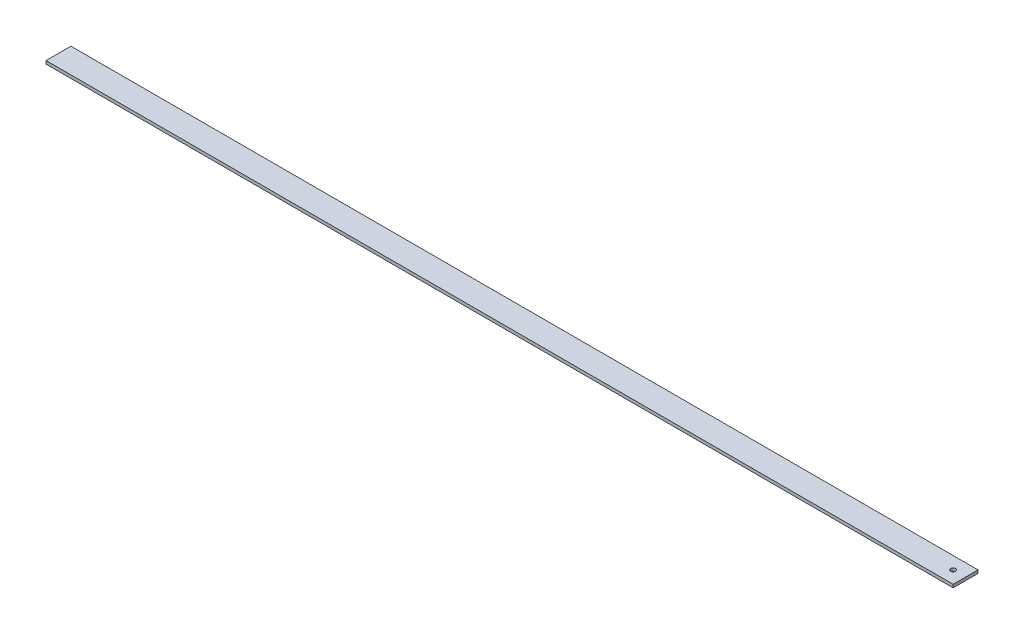
ISO-10303-21;
HEADER;
FILE_DESCRIPTION(('STEP AP214'),'2;1');
FILE_NAME('part.step','',(''),(''),'','','');
FILE_SCHEMA(('AUTOMOTIVE_DESIGN { 1 0 10303 214 1 1 1 1 }'));
ENDSEC;
DATA;
#1=APPLICATION_CONTEXT('core data for automotive mechanical design processes');
#2=APPLICATION_PROTOCOL_DEFINITION('international standard','automotive_design',2000,#1);
#3=PRODUCT_CONTEXT('',#1,'mechanical');
#4=PRODUCT('Part','Part','',(#3));
#5=PRODUCT_RELATED_PRODUCT_CATEGORY('part','',(#4));
#6=PRODUCT_DEFINITION_FORMATION('','',#4);
#7=PRODUCT_DEFINITION_CONTEXT('part definition',#1,'design');
#8=PRODUCT_DEFINITION('design','',#6,#7);
#9=PRODUCT_DEFINITION_SHAPE('','',#8);
#10=(LENGTH_UNIT() NAMED_UNIT(*) SI_UNIT(.MILLI.,.METRE.));
#11=(NAMED_UNIT(*) PLANE_ANGLE_UNIT() SI_UNIT($,.RADIAN.));
#12=(NAMED_UNIT(*) SI_UNIT($,.STERADIAN.) SOLID_ANGLE_UNIT());
#13=UNCERTAINTY_MEASURE_WITH_UNIT(LENGTH_MEASURE(1.E-05),#10,'distance_accuracy_value','');
#14=(GEOMETRIC_REPRESENTATION_CONTEXT(3) GLOBAL_UNCERTAINTY_ASSIGNED_CONTEXT((#13)) GLOBAL_UNIT_ASSIGNED_CONTEXT((#10,
#11,#12)) REPRESENTATION_CONTEXT('',''));
#15=CARTESIAN_POINT('',(0.,0.,0.));
#16=DIRECTION('',(0.,0.,1.));
#17=DIRECTION('',(1.,0.,0.));
#18=AXIS2_PLACEMENT_3D('',#15,#16,#17);
#19=CARTESIAN_POINT('',(-50.799999999998,6.31,249.702795));
#20=DIRECTION('',(1.,0.,0.));
#21=DIRECTION('',(0.,0.,-1.));
#22=AXIS2_PLACEMENT_3D('',#19,#20,#21);
#23=PLANE('',#22);
#24=DIRECTION('',(0.,-1.,0.));
#25=VECTOR('',#24,1.);
#26=CARTESIAN_POINT('',(-50.799999999998,114.31,198.902795));
#27=LINE('',#26,#25);
#28=CARTESIAN_POINT('',(-50.799999999998,6.31,198.902795));
#29=VERTEX_POINT('',#28);
#30=CARTESIAN_POINT('',(-50.799999999998,0.,198.902795));
#31=VERTEX_POINT('',#30);
#32=EDGE_CURVE('E78',#29,#31,#27,.T.);
#33=ORIENTED_EDGE('',*,*,#32,.T.);
#34=DIRECTION('',(0.,0.,1.));
#35=VECTOR('',#34,1.);
#36=CARTESIAN_POINT('',(-50.799999999998,0.,249.702795));
#37=LINE('',#36,#35);
#38=CARTESIAN_POINT('',(-50.799999999998,0.,249.702795));
#39=VERTEX_POINT('',#38);
#40=EDGE_CURVE('E89',#31,#39,#37,.T.);
#41=ORIENTED_EDGE('',*,*,#40,.T.);
#42=DIRECTION('',(0.,-1.,0.));
#43=VECTOR('',#42,1.);
#44=CARTESIAN_POINT('',(-50.799999999998,6.31,249.702795));
#45=LINE('',#44,#43);
#46=CARTESIAN_POINT('',(-50.799999999998,6.31,249.702795));
#47=VERTEX_POINT('',#46);
#48=EDGE_CURVE('E11',#47,#39,#45,.T.);
#49=ORIENTED_EDGE('',*,*,#48,.F.);
#50=DIRECTION('',(0.,0.,1.));
#51=VECTOR('',#50,1.);
#52=CARTESIAN_POINT('',(-50.799999999998,6.31,249.702795));
#53=LINE('',#52,#51);
#54=EDGE_CURVE('E47',#29,#47,#53,.T.);
#55=ORIENTED_EDGE('',*,*,#54,.F.);
#56=EDGE_LOOP('',(#33,#41,#49,#55));
#57=FACE_BOUND('',#56,.T.);
#58=ADVANCED_FACE('F32',(#57),#23,.F.);
#59=CARTESIAN_POINT('',(0.,6.31,0.));
#60=DIRECTION('',(0.,-1.,0.));
#61=DIRECTION('',(0.,0.,-1.));
#62=AXIS2_PLACEMENT_3D('',#59,#60,#61);
#63=PLANE('',#62);
#64=CARTESIAN_POINT('',(1774.69999999998,6.31,224.302795000009));
#65=DIRECTION('',(0.,-1.,0.));
#66=DIRECTION('',(0.,0.,-1.));
#67=AXIS2_PLACEMENT_3D('',#64,#65,#66);
#68=CIRCLE('',#67,4.99999999997232);
#69=CARTESIAN_POINT('',(1774.69999999998,6.31,219.302795000037));
#70=VERTEX_POINT('',#69);
#71=EDGE_CURVE('E90',#70,#70,#68,.T.);
#72=ORIENTED_EDGE('',*,*,#71,.T.);
#73=EDGE_LOOP('',(#72));
#74=FACE_BOUND('',#73,.T.);
#75=DIRECTION('',(-1.,0.,0.));
#76=VECTOR('',#75,1.);
#77=CARTESIAN_POINT('',(-1.11022302462516E-13,6.31,198.902795));
#78=LINE('',#77,#76);
#79=CARTESIAN_POINT('',(1800.1,6.31,198.902795));
#80=VERTEX_POINT('',#79);
#81=EDGE_CURVE('E67',#80,#29,#78,.T.);
#82=ORIENTED_EDGE('',*,*,#81,.T.);
#83=ORIENTED_EDGE('',*,*,#54,.T.);
#84=DIRECTION('',(1.,0.,0.));
#85=VECTOR('',#84,1.);
#86=CARTESIAN_POINT('',(1742.85,6.31,249.702795));
#87=LINE('',#86,#85);
#88=CARTESIAN_POINT('',(1800.1,6.31,249.702795));
#89=VERTEX_POINT('',#88);
#90=EDGE_CURVE('E41',#47,#89,#87,.T.);
#91=ORIENTED_EDGE('',*,*,#90,.T.);
#92=DIRECTION('',(0.,0.,1.));
#93=VECTOR('',#92,1.);
#94=CARTESIAN_POINT('',(1800.1,6.31,249.702795));
#95=LINE('',#94,#93);
#96=EDGE_CURVE('E71',#80,#89,#95,.T.);
#97=ORIENTED_EDGE('',*,*,#96,.F.);
#98=EDGE_LOOP('',(#82,#83,#91,#97));
#99=FACE_BOUND('',#98,.T.);
#100=ADVANCED_FACE('F69',(#74,#99),#63,.F.);
#101=CARTESIAN_POINT('',(0.,0.,0.));
#102=DIRECTION('',(0.,-1.,0.));
#103=DIRECTION('',(0.,0.,-1.));
#104=AXIS2_PLACEMENT_3D('',#101,#102,#103);
#105=PLANE('',#104);
#106=CARTESIAN_POINT('',(1774.69999999998,0.,224.302795000009));
#107=DIRECTION('',(0.,-1.,0.));
#108=DIRECTION('',(0.,0.,-1.));
#109=AXIS2_PLACEMENT_3D('',#106,#107,#108);
#110=CIRCLE('',#109,4.99999999997232);
#111=CARTESIAN_POINT('',(1774.69999999998,0.,219.302795000037));
#112=VERTEX_POINT('',#111);
#113=EDGE_CURVE('E107',#112,#112,#110,.T.);
#114=ORIENTED_EDGE('',*,*,#113,.F.);
#115=EDGE_LOOP('',(#114));
#116=FACE_BOUND('',#115,.T.);
#117=ORIENTED_EDGE('',*,*,#40,.F.);
#118=DIRECTION('',(-1.,0.,0.));
#119=VECTOR('',#118,1.);
#120=CARTESIAN_POINT('',(-1.11022302462516E-13,0.,198.902795));
#121=LINE('',#120,#119);
#122=CARTESIAN_POINT('',(1800.1,0.,198.902795));
#123=VERTEX_POINT('',#122);
#124=EDGE_CURVE('E79',#123,#31,#121,.T.);
#125=ORIENTED_EDGE('',*,*,#124,.F.);
#126=DIRECTION('',(0.,0.,-1.));
#127=VECTOR('',#126,1.);
#128=CARTESIAN_POINT('',(1800.1,0.,198.902795));
#129=LINE('',#128,#127);
#130=CARTESIAN_POINT('',(1800.1,0.,249.702795));
#131=VERTEX_POINT('',#130);
#132=EDGE_CURVE('E102',#131,#123,#129,.T.);
#133=ORIENTED_EDGE('',*,*,#132,.F.);
#134=DIRECTION('',(1.,0.,0.));
#135=VECTOR('',#134,1.);
#136=CARTESIAN_POINT('',(1742.85,0.,249.702795));
#137=LINE('',#136,#135);
#138=EDGE_CURVE('E75',#39,#131,#137,.T.);
#139=ORIENTED_EDGE('',*,*,#138,.F.);
#140=EDGE_LOOP('',(#117,#125,#133,#139));
#141=FACE_BOUND('',#140,.T.);
#142=ADVANCED_FACE('F104',(#116,#141),#105,.T.);
#143=CARTESIAN_POINT('',(-1.11022302462516E-13,6.31,198.902795));
#144=DIRECTION('',(0.,0.,1.));
#145=DIRECTION('',(1.,0.,0.));
#146=AXIS2_PLACEMENT_3D('',#143,#144,#145);
#147=PLANE('',#146);
#148=ORIENTED_EDGE('',*,*,#124,.T.);
#149=ORIENTED_EDGE('',*,*,#32,.F.);
#150=ORIENTED_EDGE('',*,*,#81,.F.);
#151=DIRECTION('',(0.,1.,0.));
#152=VECTOR('',#151,1.);
#153=CARTESIAN_POINT('',(1800.1,6.31,198.902795));
#154=LINE('',#153,#152);
#155=EDGE_CURVE('E105',#123,#80,#154,.T.);
#156=ORIENTED_EDGE('',*,*,#155,.F.);
#157=EDGE_LOOP('',(#148,#149,#150,#156));
#158=FACE_BOUND('',#157,.T.);
#159=ADVANCED_FACE('F34',(#158),#147,.F.);
#160=CARTESIAN_POINT('',(1742.85,6.31,249.702795));
#161=DIRECTION('',(0.,0.,-1.));
#162=DIRECTION('',(-1.,0.,0.));
#163=AXIS2_PLACEMENT_3D('',#160,#161,#162);
#164=PLANE('',#163);
#165=ORIENTED_EDGE('',*,*,#138,.T.);
#166=DIRECTION('',(0.,-1.,0.));
#167=VECTOR('',#166,1.);
#168=CARTESIAN_POINT('',(1800.1,0.,249.702795));
#169=LINE('',#168,#167);
#170=EDGE_CURVE('E96',#89,#131,#169,.T.);
#171=ORIENTED_EDGE('',*,*,#170,.F.);
#172=ORIENTED_EDGE('',*,*,#90,.F.);
#173=ORIENTED_EDGE('',*,*,#48,.T.);
#174=EDGE_LOOP('',(#165,#171,#172,#173));
#175=FACE_BOUND('',#174,.T.);
#176=ADVANCED_FACE('F95',(#175),#164,.F.);
#177=CARTESIAN_POINT('',(1774.69999999998,50.,224.302795000009));
#178=DIRECTION('',(0.,-1.,0.));
#179=DIRECTION('',(0.,0.,-1.));
#180=AXIS2_PLACEMENT_3D('',#177,#178,#179);
#181=CYLINDRICAL_SURFACE('',#180,4.99999999997232);
#182=ORIENTED_EDGE('',*,*,#113,.T.);
#183=EDGE_LOOP('',(#182));
#184=FACE_BOUND('',#183,.T.);
#185=ORIENTED_EDGE('',*,*,#71,.F.);
#186=EDGE_LOOP('',(#185));
#187=FACE_BOUND('',#186,.T.);
#188=ADVANCED_FACE('F116',(#184,#187),#181,.F.);
#189=CARTESIAN_POINT('',(1800.1,0.,0.));
#190=DIRECTION('',(-1.,0.,0.));
#191=DIRECTION('',(0.,0.,1.));
#192=AXIS2_PLACEMENT_3D('',#189,#190,#191);
#193=PLANE('',#192);
#194=ORIENTED_EDGE('',*,*,#96,.T.);
#195=ORIENTED_EDGE('',*,*,#170,.T.);
#196=ORIENTED_EDGE('',*,*,#132,.T.);
#197=ORIENTED_EDGE('',*,*,#155,.T.);
#198=EDGE_LOOP('',(#194,#195,#196,#197));
#199=FACE_BOUND('',#198,.T.);
#200=ADVANCED_FACE('F101',(#199),#193,.F.);
#201=CLOSED_SHELL('',(#58,#100,#142,#159,#176,#188,#200));
#202=MANIFOLD_SOLID_BREP('B2',#201);
#203=ADVANCED_BREP_SHAPE_REPRESENTATION('',(#18,#202),#14);
#204=SHAPE_DEFINITION_REPRESENTATION(#9,#203);
ENDSEC;
END-ISO-10303-21;
